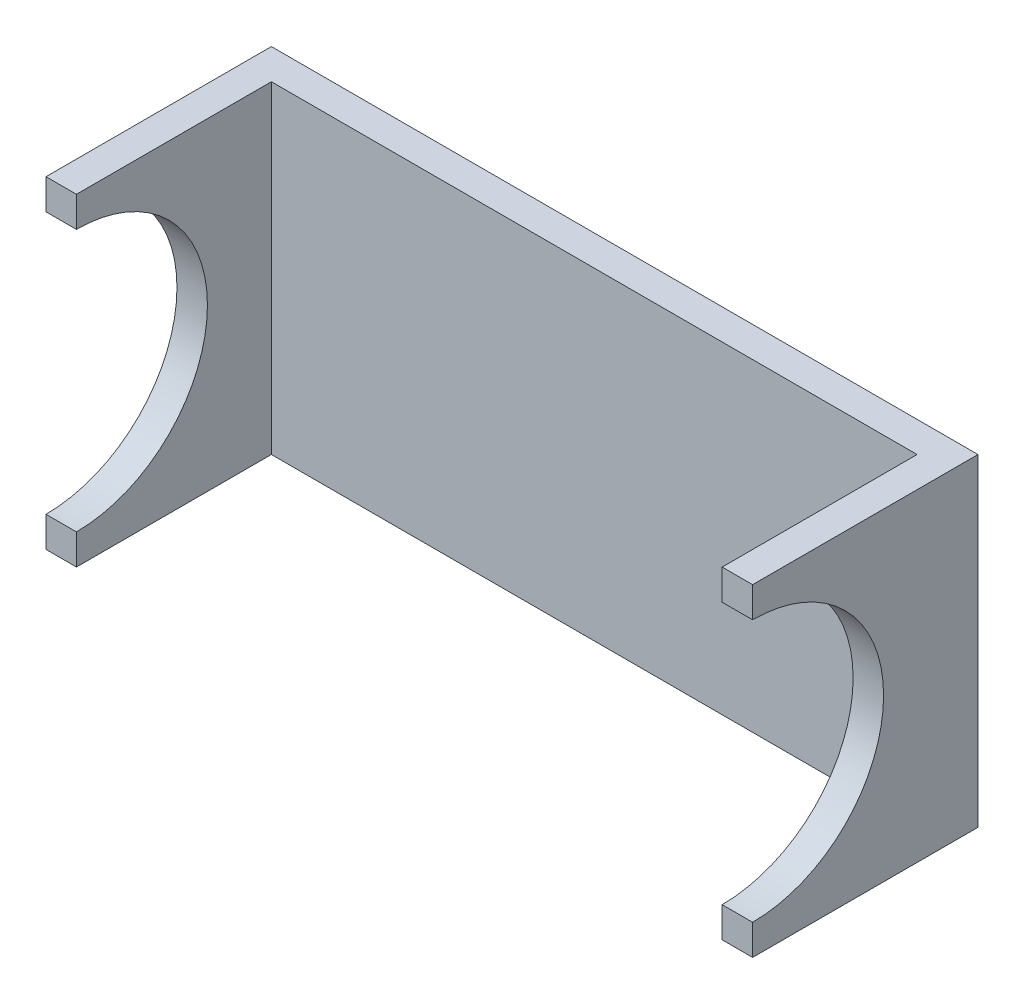
ISO-10303-21;
HEADER;
FILE_DESCRIPTION(('STEP AP214'),'2;1');
FILE_NAME('part.step','',(''),(''),'','','');
FILE_SCHEMA(('AUTOMOTIVE_DESIGN { 1 0 10303 214 1 1 1 1 }'));
ENDSEC;
DATA;
#1=APPLICATION_CONTEXT('core data for automotive mechanical design processes');
#2=APPLICATION_PROTOCOL_DEFINITION('international standard','automotive_design',2000,#1);
#3=PRODUCT_CONTEXT('',#1,'mechanical');
#4=PRODUCT('Part','Part','',(#3));
#5=PRODUCT_RELATED_PRODUCT_CATEGORY('part','',(#4));
#6=PRODUCT_DEFINITION_FORMATION('','',#4);
#7=PRODUCT_DEFINITION_CONTEXT('part definition',#1,'design');
#8=PRODUCT_DEFINITION('design','',#6,#7);
#9=PRODUCT_DEFINITION_SHAPE('','',#8);
#10=(LENGTH_UNIT() NAMED_UNIT(*) SI_UNIT(.MILLI.,.METRE.));
#11=(NAMED_UNIT(*) PLANE_ANGLE_UNIT() SI_UNIT($,.RADIAN.));
#12=(NAMED_UNIT(*) SI_UNIT($,.STERADIAN.) SOLID_ANGLE_UNIT());
#13=UNCERTAINTY_MEASURE_WITH_UNIT(LENGTH_MEASURE(1.E-05),#10,'distance_accuracy_value','');
#14=(GEOMETRIC_REPRESENTATION_CONTEXT(3) GLOBAL_UNCERTAINTY_ASSIGNED_CONTEXT((#13)) GLOBAL_UNIT_ASSIGNED_CONTEXT((#10,
#11,#12)) REPRESENTATION_CONTEXT('',''));
#15=CARTESIAN_POINT('',(0.,0.,0.));
#16=DIRECTION('',(0.,0.,1.));
#17=DIRECTION('',(1.,0.,0.));
#18=AXIS2_PLACEMENT_3D('',#15,#16,#17);
#19=CARTESIAN_POINT('',(0.,0.,0.));
#20=DIRECTION('',(0.,0.,1.));
#21=DIRECTION('',(1.,0.,0.));
#22=AXIS2_PLACEMENT_3D('',#19,#20,#21);
#23=PLANE('',#22);
#24=DIRECTION('',(-1.,0.,0.));
#25=VECTOR('',#24,1.);
#26=CARTESIAN_POINT('',(-58.,26.5,0.));
#27=LINE('',#26,#25);
#28=CARTESIAN_POINT('',(58.,26.5,0.));
#29=VERTEX_POINT('',#28);
#30=CARTESIAN_POINT('',(-58.,26.5,0.));
#31=VERTEX_POINT('',#30);
#32=EDGE_CURVE('E191',#29,#31,#27,.T.);
#33=ORIENTED_EDGE('',*,*,#32,.F.);
#34=DIRECTION('',(0.,1.,0.));
#35=VECTOR('',#34,1.);
#36=CARTESIAN_POINT('',(58.,-26.5,0.));
#37=LINE('',#36,#35);
#38=CARTESIAN_POINT('',(58.,-26.5,0.));
#39=VERTEX_POINT('',#38);
#40=EDGE_CURVE('E196',#39,#29,#37,.T.);
#41=ORIENTED_EDGE('',*,*,#40,.F.);
#42=DIRECTION('',(1.,0.,0.));
#43=VECTOR('',#42,1.);
#44=CARTESIAN_POINT('',(-58.,-26.5,0.));
#45=LINE('',#44,#43);
#46=CARTESIAN_POINT('',(-58.,-26.5,0.));
#47=VERTEX_POINT('',#46);
#48=EDGE_CURVE('E211',#47,#39,#45,.T.);
#49=ORIENTED_EDGE('',*,*,#48,.F.);
#50=DIRECTION('',(0.,-1.,0.));
#51=VECTOR('',#50,1.);
#52=CARTESIAN_POINT('',(-58.,-26.5,0.));
#53=LINE('',#52,#51);
#54=EDGE_CURVE('E213',#31,#47,#53,.T.);
#55=ORIENTED_EDGE('',*,*,#54,.F.);
#56=EDGE_LOOP('',(#33,#41,#49,#55));
#57=FACE_BOUND('',#56,.T.);
#58=CARTESIAN_POINT('',(0.,0.,0.));
#59=DIRECTION('',(0.,0.,1.));
#60=DIRECTION('',(1.,0.,0.));
#61=AXIS2_PLACEMENT_3D('',#58,#59,#60);
#62=CIRCLE('',#61,5.);
#63=CARTESIAN_POINT('',(5.,0.,0.));
#64=VERTEX_POINT('',#63);
#65=EDGE_CURVE('E11',#64,#64,#62,.F.);
#66=ORIENTED_EDGE('',*,*,#65,.F.);
#67=EDGE_LOOP('',(#66));
#68=FACE_BOUND('',#67,.T.);
#69=ADVANCED_FACE('F37',(#57,#68),#23,.F.);
#70=CARTESIAN_POINT('',(0.,0.,37.));
#71=DIRECTION('',(0.,0.,1.));
#72=DIRECTION('',(1.,0.,0.));
#73=AXIS2_PLACEMENT_3D('',#70,#71,#72);
#74=PLANE('',#73);
#75=DIRECTION('',(-1.,0.,0.));
#76=VECTOR('',#75,1.);
#77=CARTESIAN_POINT('',(58.,21.5,37.));
#78=LINE('',#77,#76);
#79=CARTESIAN_POINT('',(-53.,21.5,37.));
#80=VERTEX_POINT('',#79);
#81=CARTESIAN_POINT('',(-58.,21.5,37.));
#82=VERTEX_POINT('',#81);
#83=EDGE_CURVE('E155',#80,#82,#78,.T.);
#84=ORIENTED_EDGE('',*,*,#83,.F.);
#85=DIRECTION('',(0.,1.,0.));
#86=VECTOR('',#85,1.);
#87=CARTESIAN_POINT('',(-53.,-26.5,37.));
#88=LINE('',#87,#86);
#89=CARTESIAN_POINT('',(-53.,26.5,37.));
#90=VERTEX_POINT('',#89);
#91=EDGE_CURVE('E169',#80,#90,#88,.T.);
#92=ORIENTED_EDGE('',*,*,#91,.T.);
#93=DIRECTION('',(-1.,0.,0.));
#94=VECTOR('',#93,1.);
#95=CARTESIAN_POINT('',(-53.,26.5,37.));
#96=LINE('',#95,#94);
#97=CARTESIAN_POINT('',(-58.,26.5,37.));
#98=VERTEX_POINT('',#97);
#99=EDGE_CURVE('E160',#90,#98,#96,.T.);
#100=ORIENTED_EDGE('',*,*,#99,.T.);
#101=DIRECTION('',(0.,-1.,0.));
#102=VECTOR('',#101,1.);
#103=CARTESIAN_POINT('',(-58.,26.5,37.));
#104=LINE('',#103,#102);
#105=EDGE_CURVE('E164',#98,#82,#104,.T.);
#106=ORIENTED_EDGE('',*,*,#105,.T.);
#107=EDGE_LOOP('',(#84,#92,#100,#106));
#108=FACE_BOUND('',#107,.T.);
#109=ADVANCED_FACE('F240',(#108),#74,.T.);
#110=CARTESIAN_POINT('',(0.,0.,37.));
#111=DIRECTION('',(0.,0.,1.));
#112=DIRECTION('',(-1.,0.,0.));
#113=AXIS2_PLACEMENT_3D('',#110,#111,#112);
#114=PLANE('',#113);
#115=DIRECTION('',(-1.,0.,0.));
#116=VECTOR('',#115,1.);
#117=CARTESIAN_POINT('',(58.,21.5,37.));
#118=LINE('',#117,#116);
#119=CARTESIAN_POINT('',(58.,21.5,37.));
#120=VERTEX_POINT('',#119);
#121=CARTESIAN_POINT('',(53.,21.5,37.));
#122=VERTEX_POINT('',#121);
#123=EDGE_CURVE('E45',#120,#122,#118,.T.);
#124=ORIENTED_EDGE('',*,*,#123,.F.);
#125=DIRECTION('',(0.,-1.,0.));
#126=VECTOR('',#125,1.);
#127=CARTESIAN_POINT('',(58.,26.5,37.));
#128=LINE('',#127,#126);
#129=CARTESIAN_POINT('',(58.,26.5,37.));
#130=VERTEX_POINT('',#129);
#131=EDGE_CURVE('E137',#130,#120,#128,.T.);
#132=ORIENTED_EDGE('',*,*,#131,.F.);
#133=DIRECTION('',(1.,0.,0.));
#134=VECTOR('',#133,1.);
#135=CARTESIAN_POINT('',(53.,26.5,37.));
#136=LINE('',#135,#134);
#137=CARTESIAN_POINT('',(53.,26.5,37.));
#138=VERTEX_POINT('',#137);
#139=EDGE_CURVE('E154',#138,#130,#136,.T.);
#140=ORIENTED_EDGE('',*,*,#139,.F.);
#141=DIRECTION('',(0.,1.,0.));
#142=VECTOR('',#141,1.);
#143=CARTESIAN_POINT('',(53.,-26.5,37.));
#144=LINE('',#143,#142);
#145=EDGE_CURVE('E138',#122,#138,#144,.T.);
#146=ORIENTED_EDGE('',*,*,#145,.F.);
#147=EDGE_LOOP('',(#124,#132,#140,#146));
#148=FACE_BOUND('',#147,.T.);
#149=ADVANCED_FACE('F135',(#148),#114,.T.);
#150=CARTESIAN_POINT('',(-58.,26.5,5.));
#151=DIRECTION('',(0.,-1.,0.));
#152=DIRECTION('',(0.,0.,-1.));
#153=AXIS2_PLACEMENT_3D('',#150,#151,#152);
#154=PLANE('',#153);
#155=ORIENTED_EDGE('',*,*,#32,.T.);
#156=DIRECTION('',(0.,0.,-1.));
#157=VECTOR('',#156,1.);
#158=CARTESIAN_POINT('',(-58.,26.5,5.));
#159=LINE('',#158,#157);
#160=EDGE_CURVE('E197',#98,#31,#159,.T.);
#161=ORIENTED_EDGE('',*,*,#160,.F.);
#162=ORIENTED_EDGE('',*,*,#99,.F.);
#163=DIRECTION('',(0.,0.,-1.));
#164=VECTOR('',#163,1.);
#165=CARTESIAN_POINT('',(-53.,26.5,37.));
#166=LINE('',#165,#164);
#167=CARTESIAN_POINT('',(-53.,26.5,5.));
#168=VERTEX_POINT('',#167);
#169=EDGE_CURVE('E173',#90,#168,#166,.T.);
#170=ORIENTED_EDGE('',*,*,#169,.T.);
#171=DIRECTION('',(-1.,0.,0.));
#172=VECTOR('',#171,1.);
#173=CARTESIAN_POINT('',(-58.,26.5,5.));
#174=LINE('',#173,#172);
#175=CARTESIAN_POINT('',(53.,26.5,5.));
#176=VERTEX_POINT('',#175);
#177=EDGE_CURVE('E194',#176,#168,#174,.T.);
#178=ORIENTED_EDGE('',*,*,#177,.F.);
#179=DIRECTION('',(0.,0.,-1.));
#180=VECTOR('',#179,1.);
#181=CARTESIAN_POINT('',(53.,26.5,37.));
#182=LINE('',#181,#180);
#183=EDGE_CURVE('E147',#138,#176,#182,.T.);
#184=ORIENTED_EDGE('',*,*,#183,.F.);
#185=ORIENTED_EDGE('',*,*,#139,.T.);
#186=DIRECTION('',(0.,0.,-1.));
#187=VECTOR('',#186,1.);
#188=CARTESIAN_POINT('',(58.,26.5,5.));
#189=LINE('',#188,#187);
#190=EDGE_CURVE('E141',#130,#29,#189,.T.);
#191=ORIENTED_EDGE('',*,*,#190,.T.);
#192=EDGE_LOOP('',(#155,#161,#162,#170,#178,#184,#185,#191));
#193=FACE_BOUND('',#192,.T.);
#194=ADVANCED_FACE('F39',(#193),#154,.F.);
#195=CARTESIAN_POINT('',(-58.,-26.5,5.));
#196=DIRECTION('',(1.,0.,0.));
#197=DIRECTION('',(0.,0.,-1.));
#198=AXIS2_PLACEMENT_3D('',#195,#196,#197);
#199=PLANE('',#198);
#200=CARTESIAN_POINT('',(-58.,-21.5,37.));
#201=VERTEX_POINT('',#200);
#202=CARTESIAN_POINT('',(-58.,-26.5,37.));
#203=VERTEX_POINT('',#202);
#204=EDGE_CURVE('E163',#201,#203,#104,.T.);
#205=ORIENTED_EDGE('',*,*,#204,.F.);
#206=CARTESIAN_POINT('',(-58.,0.,37.));
#207=DIRECTION('',(-1.,0.,0.));
#208=DIRECTION('',(0.,0.,1.));
#209=AXIS2_PLACEMENT_3D('',#206,#207,#208);
#210=CIRCLE('',#209,21.5);
#211=EDGE_CURVE('E52',#82,#201,#210,.T.);
#212=ORIENTED_EDGE('',*,*,#211,.F.);
#213=ORIENTED_EDGE('',*,*,#105,.F.);
#214=ORIENTED_EDGE('',*,*,#160,.T.);
#215=ORIENTED_EDGE('',*,*,#54,.T.);
#216=DIRECTION('',(0.,0.,-1.));
#217=VECTOR('',#216,1.);
#218=CARTESIAN_POINT('',(-58.,-26.5,5.));
#219=LINE('',#218,#217);
#220=EDGE_CURVE('E199',#203,#47,#219,.T.);
#221=ORIENTED_EDGE('',*,*,#220,.F.);
#222=EDGE_LOOP('',(#205,#212,#213,#214,#215,#221));
#223=FACE_BOUND('',#222,.T.);
#224=ADVANCED_FACE('F225',(#223),#199,.F.);
#225=CARTESIAN_POINT('',(-58.,-26.5,5.));
#226=DIRECTION('',(0.,1.,0.));
#227=DIRECTION('',(0.,0.,1.));
#228=AXIS2_PLACEMENT_3D('',#225,#226,#227);
#229=PLANE('',#228);
#230=ORIENTED_EDGE('',*,*,#48,.T.);
#231=DIRECTION('',(0.,0.,-1.));
#232=VECTOR('',#231,1.);
#233=CARTESIAN_POINT('',(58.,-26.5,5.));
#234=LINE('',#233,#232);
#235=CARTESIAN_POINT('',(58.,-26.5,37.));
#236=VERTEX_POINT('',#235);
#237=EDGE_CURVE('E204',#236,#39,#234,.T.);
#238=ORIENTED_EDGE('',*,*,#237,.F.);
#239=DIRECTION('',(-1.,0.,0.));
#240=VECTOR('',#239,1.);
#241=CARTESIAN_POINT('',(58.,-26.5,37.));
#242=LINE('',#241,#240);
#243=CARTESIAN_POINT('',(53.,-26.5,37.));
#244=VERTEX_POINT('',#243);
#245=EDGE_CURVE('E149',#236,#244,#242,.T.);
#246=ORIENTED_EDGE('',*,*,#245,.T.);
#247=DIRECTION('',(0.,0.,-1.));
#248=VECTOR('',#247,1.);
#249=CARTESIAN_POINT('',(53.,-26.5,37.));
#250=LINE('',#249,#248);
#251=CARTESIAN_POINT('',(53.,-26.5,5.));
#252=VERTEX_POINT('',#251);
#253=EDGE_CURVE('E143',#244,#252,#250,.T.);
#254=ORIENTED_EDGE('',*,*,#253,.T.);
#255=DIRECTION('',(1.,0.,0.));
#256=VECTOR('',#255,1.);
#257=CARTESIAN_POINT('',(-58.,-26.5,5.));
#258=LINE('',#257,#256);
#259=CARTESIAN_POINT('',(-53.,-26.5,5.));
#260=VERTEX_POINT('',#259);
#261=EDGE_CURVE('E182',#260,#252,#258,.T.);
#262=ORIENTED_EDGE('',*,*,#261,.F.);
#263=DIRECTION('',(0.,0.,-1.));
#264=VECTOR('',#263,1.);
#265=CARTESIAN_POINT('',(-53.,-26.5,37.));
#266=LINE('',#265,#264);
#267=CARTESIAN_POINT('',(-53.,-26.5,37.));
#268=VERTEX_POINT('',#267);
#269=EDGE_CURVE('E186',#268,#260,#266,.T.);
#270=ORIENTED_EDGE('',*,*,#269,.F.);
#271=DIRECTION('',(1.,0.,0.));
#272=VECTOR('',#271,1.);
#273=CARTESIAN_POINT('',(-58.,-26.5,37.));
#274=LINE('',#273,#272);
#275=EDGE_CURVE('E167',#203,#268,#274,.T.);
#276=ORIENTED_EDGE('',*,*,#275,.F.);
#277=ORIENTED_EDGE('',*,*,#220,.T.);
#278=EDGE_LOOP('',(#230,#238,#246,#254,#262,#270,#276,#277));
#279=FACE_BOUND('',#278,.T.);
#280=ADVANCED_FACE('F228',(#279),#229,.F.);
#281=CARTESIAN_POINT('',(58.,-26.5,5.));
#282=DIRECTION('',(-1.,0.,0.));
#283=DIRECTION('',(0.,0.,1.));
#284=AXIS2_PLACEMENT_3D('',#281,#282,#283);
#285=PLANE('',#284);
#286=ORIENTED_EDGE('',*,*,#131,.T.);
#287=CARTESIAN_POINT('',(58.,0.,37.));
#288=DIRECTION('',(-1.,0.,0.));
#289=DIRECTION('',(0.,0.,1.));
#290=AXIS2_PLACEMENT_3D('',#287,#288,#289);
#291=CIRCLE('',#290,21.5);
#292=CARTESIAN_POINT('',(58.,-21.5,37.));
#293=VERTEX_POINT('',#292);
#294=EDGE_CURVE('E124',#120,#293,#291,.T.);
#295=ORIENTED_EDGE('',*,*,#294,.T.);
#296=EDGE_CURVE('E144',#293,#236,#128,.T.);
#297=ORIENTED_EDGE('',*,*,#296,.T.);
#298=ORIENTED_EDGE('',*,*,#237,.T.);
#299=ORIENTED_EDGE('',*,*,#40,.T.);
#300=ORIENTED_EDGE('',*,*,#190,.F.);
#301=EDGE_LOOP('',(#286,#295,#297,#298,#299,#300));
#302=FACE_BOUND('',#301,.T.);
#303=ADVANCED_FACE('F139',(#302),#285,.F.);
#304=CARTESIAN_POINT('',(0.,0.,5.));
#305=DIRECTION('',(0.,0.,1.));
#306=DIRECTION('',(1.,0.,0.));
#307=AXIS2_PLACEMENT_3D('',#304,#305,#306);
#308=PLANE('',#307);
#309=DIRECTION('',(0.,1.,0.));
#310=VECTOR('',#309,1.);
#311=CARTESIAN_POINT('',(53.,-26.5,5.));
#312=LINE('',#311,#310);
#313=EDGE_CURVE('E153',#252,#176,#312,.T.);
#314=ORIENTED_EDGE('',*,*,#313,.T.);
#315=ORIENTED_EDGE('',*,*,#177,.T.);
#316=DIRECTION('',(0.,1.,0.));
#317=VECTOR('',#316,1.);
#318=CARTESIAN_POINT('',(-53.,-26.5,5.));
#319=LINE('',#318,#317);
#320=EDGE_CURVE('E159',#260,#168,#319,.T.);
#321=ORIENTED_EDGE('',*,*,#320,.F.);
#322=ORIENTED_EDGE('',*,*,#261,.T.);
#323=EDGE_LOOP('',(#314,#315,#321,#322));
#324=FACE_BOUND('',#323,.T.);
#325=ADVANCED_FACE('F249',(#324),#308,.T.);
#326=CARTESIAN_POINT('',(-53.,-26.5,37.));
#327=DIRECTION('',(-1.,0.,0.));
#328=DIRECTION('',(0.,0.,1.));
#329=AXIS2_PLACEMENT_3D('',#326,#327,#328);
#330=PLANE('',#329);
#331=ORIENTED_EDGE('',*,*,#91,.F.);
#332=CARTESIAN_POINT('',(-53.,0.,37.));
#333=DIRECTION('',(-1.,0.,0.));
#334=DIRECTION('',(0.,0.,1.));
#335=AXIS2_PLACEMENT_3D('',#332,#333,#334);
#336=CIRCLE('',#335,21.5);
#337=CARTESIAN_POINT('',(-53.,-21.5,37.));
#338=VERTEX_POINT('',#337);
#339=EDGE_CURVE('E395',#80,#338,#336,.T.);
#340=ORIENTED_EDGE('',*,*,#339,.T.);
#341=EDGE_CURVE('E170',#268,#338,#88,.T.);
#342=ORIENTED_EDGE('',*,*,#341,.F.);
#343=ORIENTED_EDGE('',*,*,#269,.T.);
#344=ORIENTED_EDGE('',*,*,#320,.T.);
#345=ORIENTED_EDGE('',*,*,#169,.F.);
#346=EDGE_LOOP('',(#331,#340,#342,#343,#344,#345));
#347=FACE_BOUND('',#346,.T.);
#348=ADVANCED_FACE('F246',(#347),#330,.F.);
#349=DIRECTION('',(-1.,0.,0.));
#350=VECTOR('',#349,1.);
#351=CARTESIAN_POINT('',(58.,-21.5,37.));
#352=LINE('',#351,#350);
#353=EDGE_CURVE('E235',#201,#338,#352,.F.);
#354=ORIENTED_EDGE('',*,*,#353,.F.);
#355=ORIENTED_EDGE('',*,*,#204,.T.);
#356=ORIENTED_EDGE('',*,*,#275,.T.);
#357=ORIENTED_EDGE('',*,*,#341,.T.);
#358=EDGE_LOOP('',(#354,#355,#356,#357));
#359=FACE_BOUND('',#358,.T.);
#360=ADVANCED_FACE('F234',(#359),#74,.T.);
#361=CARTESIAN_POINT('',(53.,-26.5,37.));
#362=DIRECTION('',(-1.,0.,0.));
#363=DIRECTION('',(0.,0.,1.));
#364=AXIS2_PLACEMENT_3D('',#361,#362,#363);
#365=PLANE('',#364);
#366=CARTESIAN_POINT('',(53.,0.,37.));
#367=DIRECTION('',(-1.,0.,0.));
#368=DIRECTION('',(0.,0.,1.));
#369=AXIS2_PLACEMENT_3D('',#366,#367,#368);
#370=CIRCLE('',#369,21.5);
#371=CARTESIAN_POINT('',(53.,-21.5,37.));
#372=VERTEX_POINT('',#371);
#373=EDGE_CURVE('E60',#122,#372,#370,.T.);
#374=ORIENTED_EDGE('',*,*,#373,.F.);
#375=ORIENTED_EDGE('',*,*,#145,.T.);
#376=ORIENTED_EDGE('',*,*,#183,.T.);
#377=ORIENTED_EDGE('',*,*,#313,.F.);
#378=ORIENTED_EDGE('',*,*,#253,.F.);
#379=EDGE_CURVE('E258',#244,#372,#144,.T.);
#380=ORIENTED_EDGE('',*,*,#379,.T.);
#381=EDGE_LOOP('',(#374,#375,#376,#377,#378,#380));
#382=FACE_BOUND('',#381,.T.);
#383=ADVANCED_FACE('F256',(#382),#365,.T.);
#384=DIRECTION('',(-1.,0.,0.));
#385=VECTOR('',#384,1.);
#386=CARTESIAN_POINT('',(58.,-21.5,37.));
#387=LINE('',#386,#385);
#388=EDGE_CURVE('E127',#372,#293,#387,.F.);
#389=ORIENTED_EDGE('',*,*,#388,.F.);
#390=ORIENTED_EDGE('',*,*,#379,.F.);
#391=ORIENTED_EDGE('',*,*,#245,.F.);
#392=ORIENTED_EDGE('',*,*,#296,.F.);
#393=EDGE_LOOP('',(#389,#390,#391,#392));
#394=FACE_BOUND('',#393,.T.);
#395=ADVANCED_FACE('F262',(#394),#114,.T.);
#396=CARTESIAN_POINT('',(58.,0.,37.));
#397=DIRECTION('',(-1.,0.,0.));
#398=DIRECTION('',(0.,0.,1.));
#399=AXIS2_PLACEMENT_3D('',#396,#397,#398);
#400=CYLINDRICAL_SURFACE('',#399,21.5);
#401=ORIENTED_EDGE('',*,*,#123,.T.);
#402=ORIENTED_EDGE('',*,*,#373,.T.);
#403=ORIENTED_EDGE('',*,*,#388,.T.);
#404=ORIENTED_EDGE('',*,*,#294,.F.);
#405=EDGE_LOOP('',(#401,#402,#403,#404));
#406=FACE_BOUND('',#405,.T.);
#407=ADVANCED_FACE('F126',(#406),#400,.F.);
#408=ORIENTED_EDGE('',*,*,#83,.T.);
#409=ORIENTED_EDGE('',*,*,#211,.T.);
#410=ORIENTED_EDGE('',*,*,#353,.T.);
#411=ORIENTED_EDGE('',*,*,#339,.F.);
#412=EDGE_LOOP('',(#408,#409,#410,#411));
#413=FACE_BOUND('',#412,.T.);
#414=ADVANCED_FACE('F269',(#413),#400,.F.);
#415=CARTESIAN_POINT('',(0.,0.,-12.));
#416=DIRECTION('',(0.,0.,1.));
#417=DIRECTION('',(1.,0.,0.));
#418=AXIS2_PLACEMENT_3D('',#415,#416,#417);
#419=CYLINDRICAL_SURFACE('',#418,5.);
#420=CARTESIAN_POINT('',(0.,0.,-12.));
#421=DIRECTION('',(0.,0.,-1.));
#422=DIRECTION('',(-1.,0.,0.));
#423=AXIS2_PLACEMENT_3D('',#420,#421,#422);
#424=CIRCLE('',#423,5.);
#425=CARTESIAN_POINT('',(-5.,0.,-12.));
#426=VERTEX_POINT('',#425);
#427=EDGE_CURVE('E236',#426,#426,#424,.T.);
#428=ORIENTED_EDGE('',*,*,#427,.F.);
#429=EDGE_LOOP('',(#428));
#430=FACE_BOUND('',#429,.T.);
#431=ORIENTED_EDGE('',*,*,#65,.T.);
#432=EDGE_LOOP('',(#431));
#433=FACE_BOUND('',#432,.T.);
#434=ADVANCED_FACE('F361',(#430,#433),#419,.T.);
#435=CARTESIAN_POINT('',(0.,0.,-12.));
#436=DIRECTION('',(0.,0.,-1.));
#437=DIRECTION('',(-1.,0.,0.));
#438=AXIS2_PLACEMENT_3D('',#435,#436,#437);
#439=PLANE('',#438);
#440=ORIENTED_EDGE('',*,*,#427,.T.);
#441=EDGE_LOOP('',(#440));
#442=FACE_BOUND('',#441,.T.);
#443=ADVANCED_FACE('F375',(#442),#439,.T.);
#444=CLOSED_SHELL('',(#69,#109,#149,#194,#224,#280,#303,#325,#348,#360,#383,#395,#407,#414,#434,#443));
#445=MANIFOLD_SOLID_BREP('B2',#444);
#446=ADVANCED_BREP_SHAPE_REPRESENTATION('',(#18,#445),#14);
#447=SHAPE_DEFINITION_REPRESENTATION(#9,#446);
ENDSEC;
END-ISO-10303-21;
